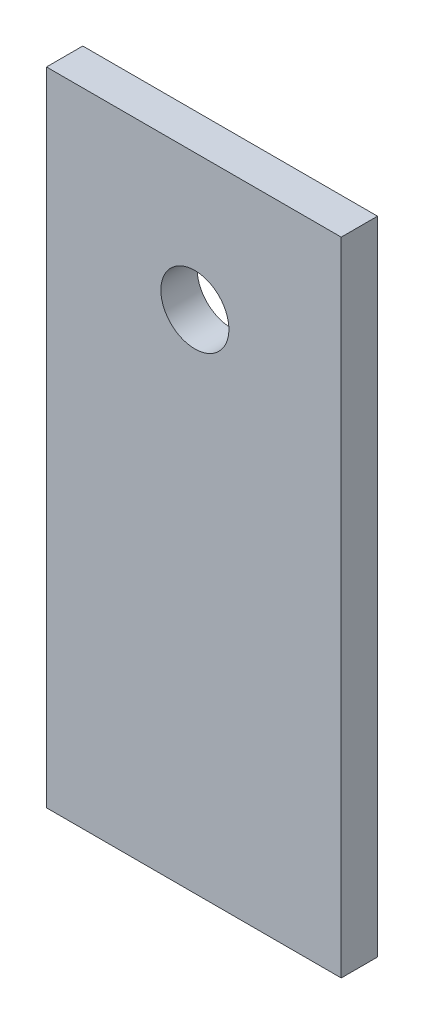
ISO-10303-21;
HEADER;
FILE_DESCRIPTION(('STEP AP214'),'2;1');
FILE_NAME('part.step','',(''),(''),'','','');
FILE_SCHEMA(('AUTOMOTIVE_DESIGN { 1 0 10303 214 1 1 1 1 }'));
ENDSEC;
DATA;
#1=APPLICATION_CONTEXT('core data for automotive mechanical design processes');
#2=APPLICATION_PROTOCOL_DEFINITION('international standard','automotive_design',2000,#1);
#3=PRODUCT_CONTEXT('',#1,'mechanical');
#4=PRODUCT('Part','Part','',(#3));
#5=PRODUCT_RELATED_PRODUCT_CATEGORY('part','',(#4));
#6=PRODUCT_DEFINITION_FORMATION('','',#4);
#7=PRODUCT_DEFINITION_CONTEXT('part definition',#1,'design');
#8=PRODUCT_DEFINITION('design','',#6,#7);
#9=PRODUCT_DEFINITION_SHAPE('','',#8);
#10=(LENGTH_UNIT() NAMED_UNIT(*) SI_UNIT(.MILLI.,.METRE.));
#11=(NAMED_UNIT(*) PLANE_ANGLE_UNIT() SI_UNIT($,.RADIAN.));
#12=(NAMED_UNIT(*) SI_UNIT($,.STERADIAN.) SOLID_ANGLE_UNIT());
#13=UNCERTAINTY_MEASURE_WITH_UNIT(LENGTH_MEASURE(1.E-05),#10,'distance_accuracy_value','');
#14=(GEOMETRIC_REPRESENTATION_CONTEXT(3) GLOBAL_UNCERTAINTY_ASSIGNED_CONTEXT((#13)) GLOBAL_UNIT_ASSIGNED_CONTEXT((#10,
#11,#12)) REPRESENTATION_CONTEXT('',''));
#15=CARTESIAN_POINT('',(0.,0.,0.));
#16=DIRECTION('',(0.,0.,1.));
#17=DIRECTION('',(1.,0.,0.));
#18=AXIS2_PLACEMENT_3D('',#15,#16,#17);
#19=CARTESIAN_POINT('',(0.,0.,0.));
#20=DIRECTION('',(0.,0.,1.));
#21=DIRECTION('',(1.,0.,0.));
#22=AXIS2_PLACEMENT_3D('',#19,#20,#21);
#23=PLANE('',#22);
#24=CARTESIAN_POINT('',(0.044533520331258,8.15,0.));
#25=DIRECTION('',(0.,0.,1.));
#26=DIRECTION('',(1.,0.,0.));
#27=AXIS2_PLACEMENT_3D('',#24,#25,#26);
#28=CIRCLE('',#27,1.5);
#29=CARTESIAN_POINT('',(-1.45546647966874,8.15,0.));
#30=VERTEX_POINT('',#29);
#31=EDGE_CURVE('E83',#30,#30,#28,.T.);
#32=ORIENTED_EDGE('',*,*,#31,.T.);
#33=EDGE_LOOP('',(#32));
#34=FACE_BOUND('',#33,.T.);
#35=DIRECTION('',(1.,0.,0.));
#36=VECTOR('',#35,1.);
#37=CARTESIAN_POINT('',(-6.5,14.15,0.));
#38=LINE('',#37,#36);
#39=CARTESIAN_POINT('',(-6.5,14.15,0.));
#40=VERTEX_POINT('',#39);
#41=CARTESIAN_POINT('',(6.5,14.15,0.));
#42=VERTEX_POINT('',#41);
#43=EDGE_CURVE('E34',#40,#42,#38,.T.);
#44=ORIENTED_EDGE('',*,*,#43,.T.);
#45=DIRECTION('',(0.,-1.,0.));
#46=VECTOR('',#45,1.);
#47=CARTESIAN_POINT('',(6.5,14.15,0.));
#48=LINE('',#47,#46);
#49=CARTESIAN_POINT('',(6.5,-14.15,0.));
#50=VERTEX_POINT('',#49);
#51=EDGE_CURVE('E99',#42,#50,#48,.T.);
#52=ORIENTED_EDGE('',*,*,#51,.T.);
#53=DIRECTION('',(-1.,0.,0.));
#54=VECTOR('',#53,1.);
#55=CARTESIAN_POINT('',(6.5,-14.15,0.));
#56=LINE('',#55,#54);
#57=CARTESIAN_POINT('',(-6.5,-14.15,0.));
#58=VERTEX_POINT('',#57);
#59=EDGE_CURVE('E27',#50,#58,#56,.T.);
#60=ORIENTED_EDGE('',*,*,#59,.T.);
#61=DIRECTION('',(0.,1.,0.));
#62=VECTOR('',#61,1.);
#63=CARTESIAN_POINT('',(-6.5,-14.15,0.));
#64=LINE('',#63,#62);
#65=EDGE_CURVE('E106',#58,#40,#64,.T.);
#66=ORIENTED_EDGE('',*,*,#65,.T.);
#67=EDGE_LOOP('',(#44,#52,#60,#66));
#68=FACE_BOUND('',#67,.T.);
#69=ADVANCED_FACE('F24',(#34,#68),#23,.F.);
#70=CARTESIAN_POINT('',(0.,0.,1.6));
#71=DIRECTION('',(0.,0.,1.));
#72=DIRECTION('',(1.,0.,0.));
#73=AXIS2_PLACEMENT_3D('',#70,#71,#72);
#74=PLANE('',#73);
#75=CARTESIAN_POINT('',(0.044533520331258,8.15,1.6));
#76=DIRECTION('',(0.,0.,-1.));
#77=DIRECTION('',(1.,0.,0.));
#78=AXIS2_PLACEMENT_3D('',#75,#76,#77);
#79=CIRCLE('',#78,1.5);
#80=CARTESIAN_POINT('',(-1.45546647966874,8.15,1.6));
#81=VERTEX_POINT('',#80);
#82=EDGE_CURVE('E72',#81,#81,#79,.T.);
#83=ORIENTED_EDGE('',*,*,#82,.T.);
#84=EDGE_LOOP('',(#83));
#85=FACE_BOUND('',#84,.T.);
#86=DIRECTION('',(-1.,0.,0.));
#87=VECTOR('',#86,1.);
#88=CARTESIAN_POINT('',(-6.5,14.15,1.6));
#89=LINE('',#88,#87);
#90=CARTESIAN_POINT('',(6.5,14.15,1.6));
#91=VERTEX_POINT('',#90);
#92=CARTESIAN_POINT('',(-6.5,14.15,1.6));
#93=VERTEX_POINT('',#92);
#94=EDGE_CURVE('E13',#91,#93,#89,.T.);
#95=ORIENTED_EDGE('',*,*,#94,.T.);
#96=DIRECTION('',(0.,-1.,0.));
#97=VECTOR('',#96,1.);
#98=CARTESIAN_POINT('',(-6.5,-14.15,1.6));
#99=LINE('',#98,#97);
#100=CARTESIAN_POINT('',(-6.5,-14.15,1.6));
#101=VERTEX_POINT('',#100);
#102=EDGE_CURVE('E108',#93,#101,#99,.T.);
#103=ORIENTED_EDGE('',*,*,#102,.T.);
#104=DIRECTION('',(1.,0.,0.));
#105=VECTOR('',#104,1.);
#106=CARTESIAN_POINT('',(6.5,-14.15,1.6));
#107=LINE('',#106,#105);
#108=CARTESIAN_POINT('',(6.5,-14.15,1.6));
#109=VERTEX_POINT('',#108);
#110=EDGE_CURVE('E107',#101,#109,#107,.T.);
#111=ORIENTED_EDGE('',*,*,#110,.T.);
#112=DIRECTION('',(0.,1.,0.));
#113=VECTOR('',#112,1.);
#114=CARTESIAN_POINT('',(6.5,14.15,1.6));
#115=LINE('',#114,#113);
#116=EDGE_CURVE('E98',#109,#91,#115,.T.);
#117=ORIENTED_EDGE('',*,*,#116,.T.);
#118=EDGE_LOOP('',(#95,#103,#111,#117));
#119=FACE_BOUND('',#118,.T.);
#120=ADVANCED_FACE('F140',(#85,#119),#74,.T.);
#121=CARTESIAN_POINT('',(6.5,14.15,0.));
#122=DIRECTION('',(0.,1.,0.));
#123=DIRECTION('',(1.,0.,0.));
#124=AXIS2_PLACEMENT_3D('',#121,#122,#123);
#125=PLANE('',#124);
#126=ORIENTED_EDGE('',*,*,#43,.F.);
#127=DIRECTION('',(0.,0.,1.));
#128=VECTOR('',#127,1.);
#129=CARTESIAN_POINT('',(-6.5,14.15,0.));
#130=LINE('',#129,#128);
#131=EDGE_CURVE('E111',#40,#93,#130,.T.);
#132=ORIENTED_EDGE('',*,*,#131,.T.);
#133=ORIENTED_EDGE('',*,*,#94,.F.);
#134=DIRECTION('',(0.,0.,1.));
#135=VECTOR('',#134,1.);
#136=CARTESIAN_POINT('',(6.5,14.15,0.));
#137=LINE('',#136,#135);
#138=EDGE_CURVE('E94',#42,#91,#137,.T.);
#139=ORIENTED_EDGE('',*,*,#138,.F.);
#140=EDGE_LOOP('',(#126,#132,#133,#139));
#141=FACE_BOUND('',#140,.T.);
#142=ADVANCED_FACE('F134',(#141),#125,.T.);
#143=CARTESIAN_POINT('',(-6.5,14.15,0.));
#144=DIRECTION('',(-1.,0.,0.));
#145=DIRECTION('',(0.,0.,1.));
#146=AXIS2_PLACEMENT_3D('',#143,#144,#145);
#147=PLANE('',#146);
#148=ORIENTED_EDGE('',*,*,#65,.F.);
#149=DIRECTION('',(0.,0.,1.));
#150=VECTOR('',#149,1.);
#151=CARTESIAN_POINT('',(-6.5,-14.15,0.));
#152=LINE('',#151,#150);
#153=EDGE_CURVE('E102',#58,#101,#152,.T.);
#154=ORIENTED_EDGE('',*,*,#153,.T.);
#155=ORIENTED_EDGE('',*,*,#102,.F.);
#156=ORIENTED_EDGE('',*,*,#131,.F.);
#157=EDGE_LOOP('',(#148,#154,#155,#156));
#158=FACE_BOUND('',#157,.T.);
#159=ADVANCED_FACE('F137',(#158),#147,.T.);
#160=CARTESIAN_POINT('',(-6.5,-14.15,0.));
#161=DIRECTION('',(0.,-1.,0.));
#162=DIRECTION('',(0.,0.,-1.));
#163=AXIS2_PLACEMENT_3D('',#160,#161,#162);
#164=PLANE('',#163);
#165=ORIENTED_EDGE('',*,*,#59,.F.);
#166=DIRECTION('',(0.,0.,1.));
#167=VECTOR('',#166,1.);
#168=CARTESIAN_POINT('',(6.5,-14.15,0.));
#169=LINE('',#168,#167);
#170=EDGE_CURVE('E117',#50,#109,#169,.T.);
#171=ORIENTED_EDGE('',*,*,#170,.T.);
#172=ORIENTED_EDGE('',*,*,#110,.F.);
#173=ORIENTED_EDGE('',*,*,#153,.F.);
#174=EDGE_LOOP('',(#165,#171,#172,#173));
#175=FACE_BOUND('',#174,.T.);
#176=ADVANCED_FACE('F146',(#175),#164,.T.);
#177=CARTESIAN_POINT('',(6.5,-14.15,0.));
#178=DIRECTION('',(1.,0.,0.));
#179=DIRECTION('',(0.,1.,0.));
#180=AXIS2_PLACEMENT_3D('',#177,#178,#179);
#181=PLANE('',#180);
#182=ORIENTED_EDGE('',*,*,#51,.F.);
#183=ORIENTED_EDGE('',*,*,#138,.T.);
#184=ORIENTED_EDGE('',*,*,#116,.F.);
#185=ORIENTED_EDGE('',*,*,#170,.F.);
#186=EDGE_LOOP('',(#182,#183,#184,#185));
#187=FACE_BOUND('',#186,.T.);
#188=ADVANCED_FACE('F150',(#187),#181,.T.);
#189=CARTESIAN_POINT('',(0.044533520331258,8.15,0.));
#190=DIRECTION('',(0.,0.,1.));
#191=DIRECTION('',(1.,0.,0.));
#192=AXIS2_PLACEMENT_3D('',#189,#190,#191);
#193=CYLINDRICAL_SURFACE('',#192,1.5);
#194=ORIENTED_EDGE('',*,*,#31,.F.);
#195=DIRECTION('',(0.,0.,1.));
#196=VECTOR('',#195,1.);
#197=CARTESIAN_POINT('',(-1.45546647966874,8.15,0.));
#198=LINE('',#197,#196);
#199=EDGE_CURVE('E80',#30,#81,#198,.T.);
#200=ORIENTED_EDGE('',*,*,#199,.T.);
#201=ORIENTED_EDGE('',*,*,#82,.F.);
#202=ORIENTED_EDGE('',*,*,#199,.F.);
#203=EDGE_LOOP('',(#194,#200,#201,#202));
#204=FACE_BOUND('',#203,.T.);
#205=ADVANCED_FACE('F82',(#204),#193,.F.);
#206=CLOSED_SHELL('',(#69,#120,#142,#159,#176,#188,#205));
#207=MANIFOLD_SOLID_BREP('B1',#206);
#208=ADVANCED_BREP_SHAPE_REPRESENTATION('',(#18,#207),#14);
#209=SHAPE_DEFINITION_REPRESENTATION(#9,#208);
ENDSEC;
END-ISO-10303-21;
